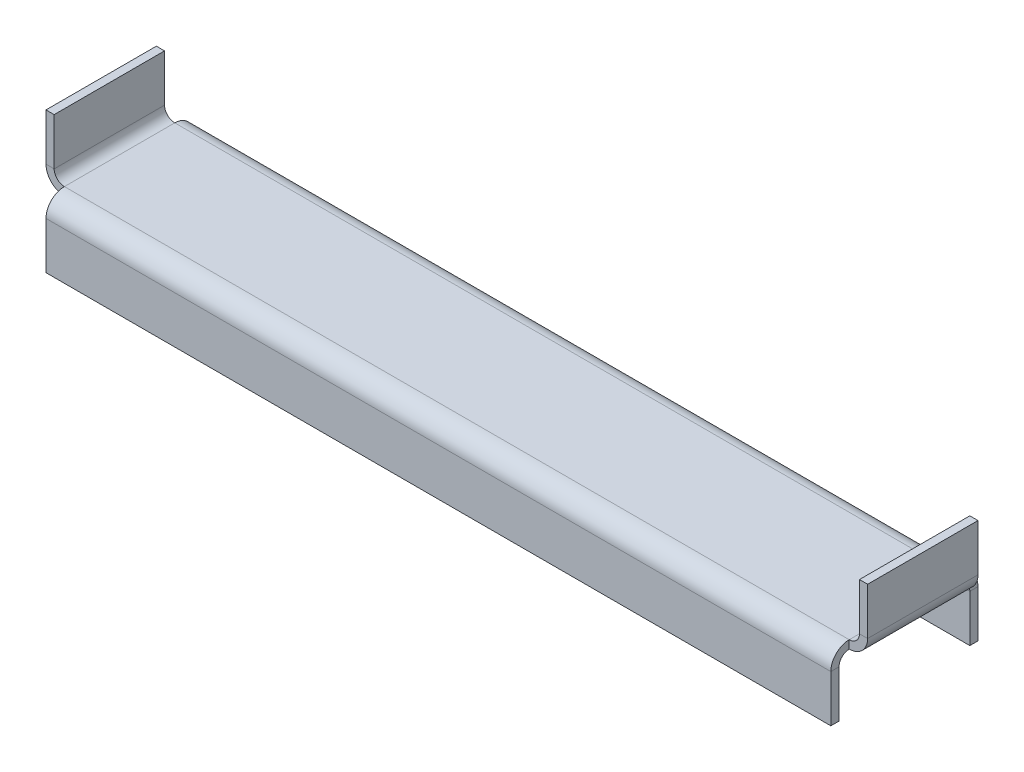
ISO-10303-21;
HEADER;
FILE_DESCRIPTION(('STEP AP214'),'2;1');
FILE_NAME('part.step','',(''),(''),'','','');
FILE_SCHEMA(('AUTOMOTIVE_DESIGN { 1 0 10303 214 1 1 1 1 }'));
ENDSEC;
DATA;
#1=APPLICATION_CONTEXT('core data for automotive mechanical design processes');
#2=APPLICATION_PROTOCOL_DEFINITION('international standard','automotive_design',2000,#1);
#3=PRODUCT_CONTEXT('',#1,'mechanical');
#4=PRODUCT('Part','Part','',(#3));
#5=PRODUCT_RELATED_PRODUCT_CATEGORY('part','',(#4));
#6=PRODUCT_DEFINITION_FORMATION('','',#4);
#7=PRODUCT_DEFINITION_CONTEXT('part definition',#1,'design');
#8=PRODUCT_DEFINITION('design','',#6,#7);
#9=PRODUCT_DEFINITION_SHAPE('','',#8);
#10=(LENGTH_UNIT() NAMED_UNIT(*) SI_UNIT(.MILLI.,.METRE.));
#11=(NAMED_UNIT(*) PLANE_ANGLE_UNIT() SI_UNIT($,.RADIAN.));
#12=(NAMED_UNIT(*) SI_UNIT($,.STERADIAN.) SOLID_ANGLE_UNIT());
#13=UNCERTAINTY_MEASURE_WITH_UNIT(LENGTH_MEASURE(1.E-05),#10,'distance_accuracy_value','');
#14=(GEOMETRIC_REPRESENTATION_CONTEXT(3) GLOBAL_UNCERTAINTY_ASSIGNED_CONTEXT((#13)) GLOBAL_UNIT_ASSIGNED_CONTEXT((#10,
#11,#12)) REPRESENTATION_CONTEXT('',''));
#15=CARTESIAN_POINT('',(0.,0.,0.));
#16=DIRECTION('',(0.,0.,1.));
#17=DIRECTION('',(1.,0.,0.));
#18=AXIS2_PLACEMENT_3D('',#15,#16,#17);
#19=CARTESIAN_POINT('',(304.8,-14.2875,-57.15));
#20=DIRECTION('',(1.,0.,0.));
#21=DIRECTION('',(0.,0.,-1.));
#22=AXIS2_PLACEMENT_3D('',#19,#20,#21);
#23=PLANE('',#22);
#24=DIRECTION('',(0.,0.,1.));
#25=VECTOR('',#24,1.);
#26=CARTESIAN_POINT('',(304.8,-14.2875,-57.15));
#27=LINE('',#26,#25);
#28=CARTESIAN_POINT('',(304.8,-14.2875,-57.15));
#29=VERTEX_POINT('',#28);
#30=CARTESIAN_POINT('',(304.8,-14.2875,-50.8));
#31=VERTEX_POINT('',#30);
#32=EDGE_CURVE('E13',#29,#31,#27,.T.);
#33=ORIENTED_EDGE('',*,*,#32,.F.);
#34=CARTESIAN_POINT('',(304.8,-14.2875,-42.8625));
#35=DIRECTION('',(-1.,0.,0.));
#36=DIRECTION('',(0.,0.,1.));
#37=AXIS2_PLACEMENT_3D('',#34,#35,#36);
#38=CIRCLE('',#37,14.2875);
#39=CARTESIAN_POINT('',(304.8,0.,-42.8625));
#40=VERTEX_POINT('',#39);
#41=EDGE_CURVE('E187',#29,#40,#38,.F.);
#42=ORIENTED_EDGE('',*,*,#41,.T.);
#43=DIRECTION('',(0.,1.,0.));
#44=VECTOR('',#43,1.);
#45=CARTESIAN_POINT('',(304.8,-6.34999999999998,-42.8625));
#46=LINE('',#45,#44);
#47=CARTESIAN_POINT('',(304.8,-6.35000000000003,-42.8625));
#48=VERTEX_POINT('',#47);
#49=EDGE_CURVE('E85',#48,#40,#46,.T.);
#50=ORIENTED_EDGE('',*,*,#49,.F.);
#51=CARTESIAN_POINT('',(304.8,-14.2875,-42.8625));
#52=DIRECTION('',(1.,0.,0.));
#53=DIRECTION('',(0.,0.,-1.));
#54=AXIS2_PLACEMENT_3D('',#51,#52,#53);
#55=CIRCLE('',#54,7.9375);
#56=EDGE_CURVE('E194',#31,#48,#55,.T.);
#57=ORIENTED_EDGE('',*,*,#56,.F.);
#58=EDGE_LOOP('',(#33,#42,#50,#57));
#59=FACE_BOUND('',#58,.T.);
#60=ADVANCED_FACE('F77',(#59),#23,.T.);
#61=CARTESIAN_POINT('',(304.8,-6.34999999999998,-42.8625));
#62=DIRECTION('',(1.,0.,0.));
#63=DIRECTION('',(0.,0.,-1.));
#64=AXIS2_PLACEMENT_3D('',#61,#62,#63);
#65=PLANE('',#64);
#66=DIRECTION('',(0.,1.,0.));
#67=VECTOR('',#66,1.);
#68=CARTESIAN_POINT('',(304.8,0.,-57.15));
#69=LINE('',#68,#67);
#70=CARTESIAN_POINT('',(304.8,-50.8,-57.15));
#71=VERTEX_POINT('',#70);
#72=EDGE_CURVE('E182',#71,#29,#69,.T.);
#73=ORIENTED_EDGE('',*,*,#72,.T.);
#74=ORIENTED_EDGE('',*,*,#32,.T.);
#75=DIRECTION('',(0.,1.,0.));
#76=VECTOR('',#75,1.);
#77=CARTESIAN_POINT('',(304.8,0.,-50.8));
#78=LINE('',#77,#76);
#79=CARTESIAN_POINT('',(304.8,-50.8,-50.8));
#80=VERTEX_POINT('',#79);
#81=EDGE_CURVE('E192',#80,#31,#78,.T.);
#82=ORIENTED_EDGE('',*,*,#81,.F.);
#83=DIRECTION('',(0.,0.,1.));
#84=VECTOR('',#83,1.);
#85=CARTESIAN_POINT('',(304.8,-50.8,-57.15));
#86=LINE('',#85,#84);
#87=EDGE_CURVE('E171',#71,#80,#86,.T.);
#88=ORIENTED_EDGE('',*,*,#87,.F.);
#89=EDGE_LOOP('',(#73,#74,#82,#88));
#90=FACE_BOUND('',#89,.T.);
#91=ADVANCED_FACE('F190',(#90),#65,.T.);
#92=CARTESIAN_POINT('',(-304.8,0.,-42.8625));
#93=DIRECTION('',(-1.,0.,0.));
#94=DIRECTION('',(0.,0.,1.));
#95=AXIS2_PLACEMENT_3D('',#92,#93,#94);
#96=PLANE('',#95);
#97=DIRECTION('',(0.,-1.,0.));
#98=VECTOR('',#97,1.);
#99=CARTESIAN_POINT('',(-304.8,0.,-42.8625));
#100=LINE('',#99,#98);
#101=CARTESIAN_POINT('',(-304.8,0.,-42.8625));
#102=VERTEX_POINT('',#101);
#103=CARTESIAN_POINT('',(-304.8,-6.34999999999998,-42.8625));
#104=VERTEX_POINT('',#103);
#105=EDGE_CURVE('E269',#102,#104,#100,.T.);
#106=ORIENTED_EDGE('',*,*,#105,.F.);
#107=CARTESIAN_POINT('',(-304.8,-14.2875,-42.8625));
#108=DIRECTION('',(-1.,0.,0.));
#109=DIRECTION('',(0.,0.,1.));
#110=AXIS2_PLACEMENT_3D('',#107,#108,#109);
#111=CIRCLE('',#110,14.2875);
#112=CARTESIAN_POINT('',(-304.8,-14.2875,-57.15));
#113=VERTEX_POINT('',#112);
#114=EDGE_CURVE('E230',#113,#102,#111,.F.);
#115=ORIENTED_EDGE('',*,*,#114,.F.);
#116=DIRECTION('',(0.,0.,-1.));
#117=VECTOR('',#116,1.);
#118=CARTESIAN_POINT('',(-304.8,-14.2875,-50.8));
#119=LINE('',#118,#117);
#120=CARTESIAN_POINT('',(-304.8,-14.2875,-50.8));
#121=VERTEX_POINT('',#120);
#122=EDGE_CURVE('E267',#121,#113,#119,.T.);
#123=ORIENTED_EDGE('',*,*,#122,.F.);
#124=CARTESIAN_POINT('',(-304.8,-14.2875,-42.8625));
#125=DIRECTION('',(1.,0.,0.));
#126=DIRECTION('',(0.,0.,-1.));
#127=AXIS2_PLACEMENT_3D('',#124,#125,#126);
#128=CIRCLE('',#127,7.9375);
#129=EDGE_CURVE('E221',#121,#104,#128,.T.);
#130=ORIENTED_EDGE('',*,*,#129,.T.);
#131=EDGE_LOOP('',(#106,#115,#123,#130));
#132=FACE_BOUND('',#131,.T.);
#133=ADVANCED_FACE('F421',(#132),#96,.T.);
#134=CARTESIAN_POINT('',(304.8,0.,42.8625));
#135=DIRECTION('',(1.,0.,0.));
#136=DIRECTION('',(0.,0.,-1.));
#137=AXIS2_PLACEMENT_3D('',#134,#135,#136);
#138=PLANE('',#137);
#139=DIRECTION('',(0.,-1.,0.));
#140=VECTOR('',#139,1.);
#141=CARTESIAN_POINT('',(304.8,0.,42.8625));
#142=LINE('',#141,#140);
#143=CARTESIAN_POINT('',(304.8,0.,42.8625));
#144=VERTEX_POINT('',#143);
#145=CARTESIAN_POINT('',(304.8,-6.35,42.8625));
#146=VERTEX_POINT('',#145);
#147=EDGE_CURVE('E264',#144,#146,#142,.T.);
#148=ORIENTED_EDGE('',*,*,#147,.F.);
#149=CARTESIAN_POINT('',(304.8,-14.2875,42.8625));
#150=DIRECTION('',(-1.,0.,0.));
#151=DIRECTION('',(0.,0.,1.));
#152=AXIS2_PLACEMENT_3D('',#149,#150,#151);
#153=CIRCLE('',#152,14.2875);
#154=CARTESIAN_POINT('',(304.8,-14.2875,57.15));
#155=VERTEX_POINT('',#154);
#156=EDGE_CURVE('E203',#144,#155,#153,.F.);
#157=ORIENTED_EDGE('',*,*,#156,.T.);
#158=DIRECTION('',(0.,0.,1.));
#159=VECTOR('',#158,1.);
#160=CARTESIAN_POINT('',(304.8,-14.2875,50.8));
#161=LINE('',#160,#159);
#162=CARTESIAN_POINT('',(304.8,-14.2875,50.8));
#163=VERTEX_POINT('',#162);
#164=EDGE_CURVE('E93',#163,#155,#161,.T.);
#165=ORIENTED_EDGE('',*,*,#164,.F.);
#166=CARTESIAN_POINT('',(304.8,-14.2875,42.8625));
#167=DIRECTION('',(1.,0.,0.));
#168=DIRECTION('',(0.,0.,-1.));
#169=AXIS2_PLACEMENT_3D('',#166,#167,#168);
#170=CIRCLE('',#169,7.9375);
#171=EDGE_CURVE('E317',#146,#163,#170,.T.);
#172=ORIENTED_EDGE('',*,*,#171,.F.);
#173=EDGE_LOOP('',(#148,#157,#165,#172));
#174=FACE_BOUND('',#173,.T.);
#175=ADVANCED_FACE('F313',(#174),#138,.T.);
#176=CARTESIAN_POINT('',(-304.8,-14.2875,57.15));
#177=DIRECTION('',(-1.,0.,0.));
#178=DIRECTION('',(0.,0.,1.));
#179=AXIS2_PLACEMENT_3D('',#176,#177,#178);
#180=PLANE('',#179);
#181=DIRECTION('',(0.,0.,-1.));
#182=VECTOR('',#181,1.);
#183=CARTESIAN_POINT('',(-304.8,-14.2875,57.15));
#184=LINE('',#183,#182);
#185=CARTESIAN_POINT('',(-304.8,-14.2875,57.15));
#186=VERTEX_POINT('',#185);
#187=CARTESIAN_POINT('',(-304.8,-14.2875,50.8));
#188=VERTEX_POINT('',#187);
#189=EDGE_CURVE('E140',#186,#188,#184,.T.);
#190=ORIENTED_EDGE('',*,*,#189,.F.);
#191=CARTESIAN_POINT('',(-304.8,-14.2875,42.8625));
#192=DIRECTION('',(-1.,0.,0.));
#193=DIRECTION('',(0.,0.,1.));
#194=AXIS2_PLACEMENT_3D('',#191,#192,#193);
#195=CIRCLE('',#194,14.2875);
#196=CARTESIAN_POINT('',(-304.8,0.,42.8625));
#197=VERTEX_POINT('',#196);
#198=EDGE_CURVE('E234',#197,#186,#195,.F.);
#199=ORIENTED_EDGE('',*,*,#198,.F.);
#200=DIRECTION('',(0.,1.,0.));
#201=VECTOR('',#200,1.);
#202=CARTESIAN_POINT('',(-304.8,-6.35,42.8625));
#203=LINE('',#202,#201);
#204=CARTESIAN_POINT('',(-304.8,-6.35000000000003,42.8625));
#205=VERTEX_POINT('',#204);
#206=EDGE_CURVE('E259',#205,#197,#203,.T.);
#207=ORIENTED_EDGE('',*,*,#206,.F.);
#208=CARTESIAN_POINT('',(-304.8,-14.2875,42.8625));
#209=DIRECTION('',(1.,0.,0.));
#210=DIRECTION('',(0.,0.,-1.));
#211=AXIS2_PLACEMENT_3D('',#208,#209,#210);
#212=CIRCLE('',#211,7.9375);
#213=EDGE_CURVE('E216',#205,#188,#212,.T.);
#214=ORIENTED_EDGE('',*,*,#213,.T.);
#215=EDGE_LOOP('',(#190,#199,#207,#214));
#216=FACE_BOUND('',#215,.T.);
#217=ADVANCED_FACE('F338',(#216),#180,.T.);
#218=CARTESIAN_POINT('',(-304.8,-6.35,42.8625));
#219=DIRECTION('',(-1.,0.,0.));
#220=DIRECTION('',(0.,0.,1.));
#221=AXIS2_PLACEMENT_3D('',#218,#219,#220);
#222=PLANE('',#221);
#223=DIRECTION('',(0.,-1.,0.));
#224=VECTOR('',#223,1.);
#225=CARTESIAN_POINT('',(-304.8,0.,57.15));
#226=LINE('',#225,#224);
#227=CARTESIAN_POINT('',(-304.8,-50.8,57.15));
#228=VERTEX_POINT('',#227);
#229=EDGE_CURVE('E206',#186,#228,#226,.T.);
#230=ORIENTED_EDGE('',*,*,#229,.F.);
#231=ORIENTED_EDGE('',*,*,#189,.T.);
#232=DIRECTION('',(0.,-1.,0.));
#233=VECTOR('',#232,1.);
#234=CARTESIAN_POINT('',(-304.8,0.,50.8));
#235=LINE('',#234,#233);
#236=CARTESIAN_POINT('',(-304.8,-50.8,50.8));
#237=VERTEX_POINT('',#236);
#238=EDGE_CURVE('E213',#188,#237,#235,.T.);
#239=ORIENTED_EDGE('',*,*,#238,.T.);
#240=DIRECTION('',(0.,0.,1.));
#241=VECTOR('',#240,1.);
#242=CARTESIAN_POINT('',(-304.8,-50.8,50.8));
#243=LINE('',#242,#241);
#244=EDGE_CURVE('E209',#237,#228,#243,.T.);
#245=ORIENTED_EDGE('',*,*,#244,.T.);
#246=EDGE_LOOP('',(#230,#231,#239,#245));
#247=FACE_BOUND('',#246,.T.);
#248=ADVANCED_FACE('F545',(#247),#222,.T.);
#249=CARTESIAN_POINT('',(304.8,0.,57.15));
#250=DIRECTION('',(0.,0.,-1.));
#251=DIRECTION('',(0.,1.,0.));
#252=AXIS2_PLACEMENT_3D('',#249,#250,#251);
#253=PLANE('',#252);
#254=ORIENTED_EDGE('',*,*,#229,.T.);
#255=DIRECTION('',(-1.,0.,0.));
#256=VECTOR('',#255,1.);
#257=CARTESIAN_POINT('',(304.8,-50.8,57.15));
#258=LINE('',#257,#256);
#259=CARTESIAN_POINT('',(304.8,-50.8,57.15));
#260=VERTEX_POINT('',#259);
#261=EDGE_CURVE('E257',#260,#228,#258,.T.);
#262=ORIENTED_EDGE('',*,*,#261,.F.);
#263=DIRECTION('',(0.,-1.,0.));
#264=VECTOR('',#263,1.);
#265=CARTESIAN_POINT('',(304.8,0.,57.15));
#266=LINE('',#265,#264);
#267=EDGE_CURVE('E146',#155,#260,#266,.T.);
#268=ORIENTED_EDGE('',*,*,#267,.F.);
#269=DIRECTION('',(-1.,0.,0.));
#270=VECTOR('',#269,1.);
#271=CARTESIAN_POINT('',(304.8,-14.2875,57.15));
#272=LINE('',#271,#270);
#273=EDGE_CURVE('E205',#155,#186,#272,.T.);
#274=ORIENTED_EDGE('',*,*,#273,.T.);
#275=EDGE_LOOP('',(#254,#262,#268,#274));
#276=FACE_BOUND('',#275,.T.);
#277=ADVANCED_FACE('F548',(#276),#253,.F.);
#278=CARTESIAN_POINT('',(304.8,-50.8,50.8));
#279=DIRECTION('',(0.,-1.,0.));
#280=DIRECTION('',(0.,0.,-1.));
#281=AXIS2_PLACEMENT_3D('',#278,#279,#280);
#282=PLANE('',#281);
#283=ORIENTED_EDGE('',*,*,#244,.F.);
#284=DIRECTION('',(-1.,0.,0.));
#285=VECTOR('',#284,1.);
#286=CARTESIAN_POINT('',(304.8,-50.8,50.8));
#287=LINE('',#286,#285);
#288=CARTESIAN_POINT('',(304.8,-50.8,50.8));
#289=VERTEX_POINT('',#288);
#290=EDGE_CURVE('E255',#289,#237,#287,.T.);
#291=ORIENTED_EDGE('',*,*,#290,.F.);
#292=DIRECTION('',(0.,0.,1.));
#293=VECTOR('',#292,1.);
#294=CARTESIAN_POINT('',(304.8,-50.8,50.8));
#295=LINE('',#294,#293);
#296=EDGE_CURVE('E402',#289,#260,#295,.T.);
#297=ORIENTED_EDGE('',*,*,#296,.T.);
#298=ORIENTED_EDGE('',*,*,#261,.T.);
#299=EDGE_LOOP('',(#283,#291,#297,#298));
#300=FACE_BOUND('',#299,.T.);
#301=ADVANCED_FACE('F552',(#300),#282,.T.);
#302=CARTESIAN_POINT('',(304.8,0.,50.8));
#303=DIRECTION('',(0.,0.,-1.));
#304=DIRECTION('',(0.,1.,0.));
#305=AXIS2_PLACEMENT_3D('',#302,#303,#304);
#306=PLANE('',#305);
#307=ORIENTED_EDGE('',*,*,#238,.F.);
#308=DIRECTION('',(-1.,0.,0.));
#309=VECTOR('',#308,1.);
#310=CARTESIAN_POINT('',(304.8,-14.2875,50.8));
#311=LINE('',#310,#309);
#312=EDGE_CURVE('E252',#163,#188,#311,.T.);
#313=ORIENTED_EDGE('',*,*,#312,.F.);
#314=DIRECTION('',(0.,-1.,0.));
#315=VECTOR('',#314,1.);
#316=CARTESIAN_POINT('',(304.8,0.,50.8));
#317=LINE('',#316,#315);
#318=EDGE_CURVE('E405',#163,#289,#317,.T.);
#319=ORIENTED_EDGE('',*,*,#318,.T.);
#320=ORIENTED_EDGE('',*,*,#290,.T.);
#321=EDGE_LOOP('',(#307,#313,#319,#320));
#322=FACE_BOUND('',#321,.T.);
#323=ADVANCED_FACE('F556',(#322),#306,.T.);
#324=CARTESIAN_POINT('',(304.8,-14.2875,42.8625));
#325=DIRECTION('',(-1.,0.,0.));
#326=DIRECTION('',(0.,0.,1.));
#327=AXIS2_PLACEMENT_3D('',#324,#325,#326);
#328=CYLINDRICAL_SURFACE('',#327,7.9375);
#329=ORIENTED_EDGE('',*,*,#213,.F.);
#330=DIRECTION('',(-1.,0.,0.));
#331=VECTOR('',#330,1.);
#332=CARTESIAN_POINT('',(304.8,-6.35,42.8625));
#333=LINE('',#332,#331);
#334=EDGE_CURVE('E249',#146,#205,#333,.T.);
#335=ORIENTED_EDGE('',*,*,#334,.F.);
#336=ORIENTED_EDGE('',*,*,#171,.T.);
#337=ORIENTED_EDGE('',*,*,#312,.T.);
#338=EDGE_LOOP('',(#329,#335,#336,#337));
#339=FACE_BOUND('',#338,.T.);
#340=ADVANCED_FACE('F327',(#339),#328,.F.);
#341=CARTESIAN_POINT('',(304.8,-6.35,57.15));
#342=DIRECTION('',(0.,-1.,0.));
#343=DIRECTION('',(0.,0.,-1.));
#344=AXIS2_PLACEMENT_3D('',#341,#342,#343);
#345=PLANE('',#344);
#346=DIRECTION('',(0.,0.,1.));
#347=VECTOR('',#346,1.);
#348=CARTESIAN_POINT('',(-304.8,-6.35,57.15));
#349=LINE('',#348,#347);
#350=EDGE_CURVE('E218',#104,#205,#349,.T.);
#351=ORIENTED_EDGE('',*,*,#350,.F.);
#352=DIRECTION('',(-1.,0.,0.));
#353=VECTOR('',#352,1.);
#354=CARTESIAN_POINT('',(304.8,-6.34999999999998,-42.8625));
#355=LINE('',#354,#353);
#356=EDGE_CURVE('E247',#48,#104,#355,.T.);
#357=ORIENTED_EDGE('',*,*,#356,.F.);
#358=DIRECTION('',(0.,0.,1.));
#359=VECTOR('',#358,1.);
#360=CARTESIAN_POINT('',(304.8,-6.35,57.15));
#361=LINE('',#360,#359);
#362=EDGE_CURVE('E334',#48,#146,#361,.T.);
#363=ORIENTED_EDGE('',*,*,#362,.T.);
#364=ORIENTED_EDGE('',*,*,#334,.T.);
#365=EDGE_LOOP('',(#351,#357,#363,#364));
#366=FACE_BOUND('',#365,.T.);
#367=ADVANCED_FACE('F332',(#366),#345,.T.);
#368=CARTESIAN_POINT('',(304.8,-14.2875,-42.8625));
#369=DIRECTION('',(-1.,0.,0.));
#370=DIRECTION('',(0.,0.,1.));
#371=AXIS2_PLACEMENT_3D('',#368,#369,#370);
#372=CYLINDRICAL_SURFACE('',#371,7.9375);
#373=ORIENTED_EDGE('',*,*,#129,.F.);
#374=DIRECTION('',(-1.,0.,0.));
#375=VECTOR('',#374,1.);
#376=CARTESIAN_POINT('',(304.8,-14.2875,-50.8));
#377=LINE('',#376,#375);
#378=EDGE_CURVE('E244',#31,#121,#377,.T.);
#379=ORIENTED_EDGE('',*,*,#378,.F.);
#380=ORIENTED_EDGE('',*,*,#56,.T.);
#381=ORIENTED_EDGE('',*,*,#356,.T.);
#382=EDGE_LOOP('',(#373,#379,#380,#381));
#383=FACE_BOUND('',#382,.T.);
#384=ADVANCED_FACE('F413',(#383),#372,.F.);
#385=CARTESIAN_POINT('',(304.8,0.,-50.8));
#386=DIRECTION('',(0.,0.,1.));
#387=DIRECTION('',(0.,-1.,0.));
#388=AXIS2_PLACEMENT_3D('',#385,#386,#387);
#389=PLANE('',#388);
#390=DIRECTION('',(0.,1.,0.));
#391=VECTOR('',#390,1.);
#392=CARTESIAN_POINT('',(-304.8,0.,-50.8));
#393=LINE('',#392,#391);
#394=CARTESIAN_POINT('',(-304.8,-50.8,-50.8));
#395=VERTEX_POINT('',#394);
#396=EDGE_CURVE('E224',#395,#121,#393,.T.);
#397=ORIENTED_EDGE('',*,*,#396,.F.);
#398=DIRECTION('',(-1.,0.,0.));
#399=VECTOR('',#398,1.);
#400=CARTESIAN_POINT('',(304.8,-50.8,-50.8));
#401=LINE('',#400,#399);
#402=EDGE_CURVE('E177',#80,#395,#401,.T.);
#403=ORIENTED_EDGE('',*,*,#402,.F.);
#404=ORIENTED_EDGE('',*,*,#81,.T.);
#405=ORIENTED_EDGE('',*,*,#378,.T.);
#406=EDGE_LOOP('',(#397,#403,#404,#405));
#407=FACE_BOUND('',#406,.T.);
#408=ADVANCED_FACE('F417',(#407),#389,.T.);
#409=CARTESIAN_POINT('',(304.8,-50.8,-57.15));
#410=DIRECTION('',(0.,-1.,0.));
#411=DIRECTION('',(0.,0.,-1.));
#412=AXIS2_PLACEMENT_3D('',#409,#410,#411);
#413=PLANE('',#412);
#414=DIRECTION('',(0.,0.,1.));
#415=VECTOR('',#414,1.);
#416=CARTESIAN_POINT('',(-304.8,-50.8,-57.15));
#417=LINE('',#416,#415);
#418=CARTESIAN_POINT('',(-304.8,-50.8,-57.15));
#419=VERTEX_POINT('',#418);
#420=EDGE_CURVE('E173',#419,#395,#417,.T.);
#421=ORIENTED_EDGE('',*,*,#420,.F.);
#422=DIRECTION('',(-1.,0.,0.));
#423=VECTOR('',#422,1.);
#424=CARTESIAN_POINT('',(304.8,-50.8,-57.15));
#425=LINE('',#424,#423);
#426=EDGE_CURVE('E167',#71,#419,#425,.T.);
#427=ORIENTED_EDGE('',*,*,#426,.F.);
#428=ORIENTED_EDGE('',*,*,#87,.T.);
#429=ORIENTED_EDGE('',*,*,#402,.T.);
#430=EDGE_LOOP('',(#421,#427,#428,#429));
#431=FACE_BOUND('',#430,.T.);
#432=ADVANCED_FACE('F169',(#431),#413,.T.);
#433=CARTESIAN_POINT('',(304.8,0.,-57.15));
#434=DIRECTION('',(0.,0.,1.));
#435=DIRECTION('',(0.,-1.,0.));
#436=AXIS2_PLACEMENT_3D('',#433,#434,#435);
#437=PLANE('',#436);
#438=DIRECTION('',(0.,1.,0.));
#439=VECTOR('',#438,1.);
#440=CARTESIAN_POINT('',(-304.8,0.,-57.15));
#441=LINE('',#440,#439);
#442=EDGE_CURVE('E228',#419,#113,#441,.T.);
#443=ORIENTED_EDGE('',*,*,#442,.T.);
#444=DIRECTION('',(-1.,0.,0.));
#445=VECTOR('',#444,1.);
#446=CARTESIAN_POINT('',(304.8,-14.2875,-57.15));
#447=LINE('',#446,#445);
#448=EDGE_CURVE('E178',#29,#113,#447,.T.);
#449=ORIENTED_EDGE('',*,*,#448,.F.);
#450=ORIENTED_EDGE('',*,*,#72,.F.);
#451=ORIENTED_EDGE('',*,*,#426,.T.);
#452=EDGE_LOOP('',(#443,#449,#450,#451));
#453=FACE_BOUND('',#452,.T.);
#454=ADVANCED_FACE('F183',(#453),#437,.F.);
#455=CARTESIAN_POINT('',(304.8,-14.2875,-42.8625));
#456=DIRECTION('',(-1.,0.,0.));
#457=DIRECTION('',(0.,0.,1.));
#458=AXIS2_PLACEMENT_3D('',#455,#456,#457);
#459=CYLINDRICAL_SURFACE('',#458,14.2875);
#460=ORIENTED_EDGE('',*,*,#114,.T.);
#461=DIRECTION('',(-1.,0.,0.));
#462=VECTOR('',#461,1.);
#463=CARTESIAN_POINT('',(304.8,0.,-42.8625));
#464=LINE('',#463,#462);
#465=EDGE_CURVE('E240',#40,#102,#464,.T.);
#466=ORIENTED_EDGE('',*,*,#465,.F.);
#467=ORIENTED_EDGE('',*,*,#41,.F.);
#468=ORIENTED_EDGE('',*,*,#448,.T.);
#469=EDGE_LOOP('',(#460,#466,#467,#468));
#470=FACE_BOUND('',#469,.T.);
#471=ADVANCED_FACE('F302',(#470),#459,.T.);
#472=CARTESIAN_POINT('',(304.8,0.,57.15));
#473=DIRECTION('',(0.,-1.,0.));
#474=DIRECTION('',(0.,0.,-1.));
#475=AXIS2_PLACEMENT_3D('',#472,#473,#474);
#476=PLANE('',#475);
#477=DIRECTION('',(0.,0.,1.));
#478=VECTOR('',#477,1.);
#479=CARTESIAN_POINT('',(-304.8,0.,57.15));
#480=LINE('',#479,#478);
#481=EDGE_CURVE('E133',#102,#197,#480,.T.);
#482=ORIENTED_EDGE('',*,*,#481,.T.);
#483=DIRECTION('',(-1.,0.,0.));
#484=VECTOR('',#483,1.);
#485=CARTESIAN_POINT('',(304.8,0.,42.8625));
#486=LINE('',#485,#484);
#487=EDGE_CURVE('E238',#144,#197,#486,.T.);
#488=ORIENTED_EDGE('',*,*,#487,.F.);
#489=DIRECTION('',(0.,0.,1.));
#490=VECTOR('',#489,1.);
#491=CARTESIAN_POINT('',(304.8,0.,57.15));
#492=LINE('',#491,#490);
#493=EDGE_CURVE('E200',#40,#144,#492,.T.);
#494=ORIENTED_EDGE('',*,*,#493,.F.);
#495=ORIENTED_EDGE('',*,*,#465,.T.);
#496=EDGE_LOOP('',(#482,#488,#494,#495));
#497=FACE_BOUND('',#496,.T.);
#498=ADVANCED_FACE('F304',(#497),#476,.F.);
#499=CARTESIAN_POINT('',(304.8,-14.2875,42.8625));
#500=DIRECTION('',(-1.,0.,0.));
#501=DIRECTION('',(0.,0.,1.));
#502=AXIS2_PLACEMENT_3D('',#499,#500,#501);
#503=CYLINDRICAL_SURFACE('',#502,14.2875);
#504=ORIENTED_EDGE('',*,*,#198,.T.);
#505=ORIENTED_EDGE('',*,*,#273,.F.);
#506=ORIENTED_EDGE('',*,*,#156,.F.);
#507=ORIENTED_EDGE('',*,*,#487,.T.);
#508=EDGE_LOOP('',(#504,#505,#506,#507));
#509=FACE_BOUND('',#508,.T.);
#510=ADVANCED_FACE('F310',(#509),#503,.T.);
#511=CARTESIAN_POINT('',(304.8,-14.2875,42.8625));
#512=DIRECTION('',(1.,0.,0.));
#513=DIRECTION('',(0.,0.,-1.));
#514=AXIS2_PLACEMENT_3D('',#511,#512,#513);
#515=PLANE('',#514);
#516=ORIENTED_EDGE('',*,*,#267,.T.);
#517=ORIENTED_EDGE('',*,*,#296,.F.);
#518=ORIENTED_EDGE('',*,*,#318,.F.);
#519=ORIENTED_EDGE('',*,*,#164,.T.);
#520=EDGE_LOOP('',(#516,#517,#518,#519));
#521=FACE_BOUND('',#520,.T.);
#522=ADVANCED_FACE('F579',(#521),#515,.T.);
#523=CARTESIAN_POINT('',(-304.8,-14.2875,42.8625));
#524=DIRECTION('',(1.,0.,0.));
#525=DIRECTION('',(0.,0.,-1.));
#526=AXIS2_PLACEMENT_3D('',#523,#524,#525);
#527=PLANE('',#526);
#528=ORIENTED_EDGE('',*,*,#396,.T.);
#529=ORIENTED_EDGE('',*,*,#122,.T.);
#530=ORIENTED_EDGE('',*,*,#442,.F.);
#531=ORIENTED_EDGE('',*,*,#420,.T.);
#532=EDGE_LOOP('',(#528,#529,#530,#531));
#533=FACE_BOUND('',#532,.T.);
#534=ADVANCED_FACE('F419',(#533),#527,.F.);
#535=CARTESIAN_POINT('',(304.8,7.93750000000002,42.8625));
#536=DIRECTION('',(0.,0.,1.));
#537=DIRECTION('',(1.,0.,0.));
#538=AXIS2_PLACEMENT_3D('',#535,#536,#537);
#539=PLANE('',#538);
#540=DIRECTION('',(-1.,0.,0.));
#541=VECTOR('',#540,1.);
#542=CARTESIAN_POINT('',(319.0875,7.93749999999996,42.8625));
#543=LINE('',#542,#541);
#544=CARTESIAN_POINT('',(312.7375,7.93749999999999,42.8625));
#545=VERTEX_POINT('',#544);
#546=CARTESIAN_POINT('',(319.0875,7.93749999999996,42.8625));
#547=VERTEX_POINT('',#546);
#548=EDGE_CURVE('E359',#545,#547,#543,.F.);
#549=ORIENTED_EDGE('',*,*,#548,.F.);
#550=CARTESIAN_POINT('',(304.8,7.93750000000002,42.8625));
#551=DIRECTION('',(0.,0.,-1.));
#552=DIRECTION('',(-1.,0.,0.));
#553=AXIS2_PLACEMENT_3D('',#550,#551,#552);
#554=CIRCLE('',#553,7.93750000000004);
#555=EDGE_CURVE('E297',#144,#545,#554,.F.);
#556=ORIENTED_EDGE('',*,*,#555,.F.);
#557=ORIENTED_EDGE('',*,*,#147,.T.);
#558=CARTESIAN_POINT('',(304.8,7.93750000000002,42.8625));
#559=DIRECTION('',(0.,0.,-1.));
#560=DIRECTION('',(-1.,0.,0.));
#561=AXIS2_PLACEMENT_3D('',#558,#559,#560);
#562=CIRCLE('',#561,14.2875);
#563=EDGE_CURVE('E210',#146,#547,#562,.F.);
#564=ORIENTED_EDGE('',*,*,#563,.T.);
#565=EDGE_LOOP('',(#549,#556,#557,#564));
#566=FACE_BOUND('',#565,.T.);
#567=ADVANCED_FACE('F323',(#566),#539,.T.);
#568=CARTESIAN_POINT('',(304.8,7.93750000000002,-42.8625));
#569=DIRECTION('',(0.,0.,1.));
#570=DIRECTION('',(1.,0.,0.));
#571=AXIS2_PLACEMENT_3D('',#568,#569,#570);
#572=PLANE('',#571);
#573=CARTESIAN_POINT('',(304.8,7.93750000000002,-42.8625));
#574=DIRECTION('',(0.,0.,-1.));
#575=DIRECTION('',(-1.,0.,0.));
#576=AXIS2_PLACEMENT_3D('',#573,#574,#575);
#577=CIRCLE('',#576,7.93750000000004);
#578=CARTESIAN_POINT('',(312.7375,7.93749999999999,-42.8625));
#579=VERTEX_POINT('',#578);
#580=EDGE_CURVE('E280',#579,#40,#577,.T.);
#581=ORIENTED_EDGE('',*,*,#580,.F.);
#582=DIRECTION('',(-1.,0.,0.));
#583=VECTOR('',#582,1.);
#584=CARTESIAN_POINT('',(312.7375,7.93749999999999,-42.8625));
#585=LINE('',#584,#583);
#586=CARTESIAN_POINT('',(319.0875,7.93749999999996,-42.8625));
#587=VERTEX_POINT('',#586);
#588=EDGE_CURVE('E394',#579,#587,#585,.F.);
#589=ORIENTED_EDGE('',*,*,#588,.T.);
#590=CARTESIAN_POINT('',(304.8,7.93750000000002,-42.8625));
#591=DIRECTION('',(0.,0.,-1.));
#592=DIRECTION('',(-1.,0.,0.));
#593=AXIS2_PLACEMENT_3D('',#590,#591,#592);
#594=CIRCLE('',#593,14.2875);
#595=EDGE_CURVE('E283',#587,#48,#594,.T.);
#596=ORIENTED_EDGE('',*,*,#595,.T.);
#597=ORIENTED_EDGE('',*,*,#49,.T.);
#598=EDGE_LOOP('',(#581,#589,#596,#597));
#599=FACE_BOUND('',#598,.T.);
#600=ADVANCED_FACE('F278',(#599),#572,.F.);
#601=CARTESIAN_POINT('',(304.8,7.93750000000002,-42.8625));
#602=DIRECTION('',(0.,0.,-1.));
#603=DIRECTION('',(1.,0.,0.));
#604=AXIS2_PLACEMENT_3D('',#601,#602,#603);
#605=CYLINDRICAL_SURFACE('',#604,14.2875);
#606=ORIENTED_EDGE('',*,*,#362,.F.);
#607=ORIENTED_EDGE('',*,*,#595,.F.);
#608=DIRECTION('',(0.,0.,-1.));
#609=VECTOR('',#608,1.);
#610=CARTESIAN_POINT('',(319.0875,7.93749999999996,42.8625));
#611=LINE('',#610,#609);
#612=EDGE_CURVE('E391',#587,#547,#611,.F.);
#613=ORIENTED_EDGE('',*,*,#612,.T.);
#614=ORIENTED_EDGE('',*,*,#563,.F.);
#615=EDGE_LOOP('',(#606,#607,#613,#614));
#616=FACE_BOUND('',#615,.T.);
#617=ADVANCED_FACE('F522',(#616),#605,.T.);
#618=CARTESIAN_POINT('',(304.8,7.93750000000002,-42.8625));
#619=DIRECTION('',(0.,0.,-1.));
#620=DIRECTION('',(1.,0.,0.));
#621=AXIS2_PLACEMENT_3D('',#618,#619,#620);
#622=CYLINDRICAL_SURFACE('',#621,7.93750000000004);
#623=ORIENTED_EDGE('',*,*,#493,.T.);
#624=ORIENTED_EDGE('',*,*,#555,.T.);
#625=DIRECTION('',(0.,0.,-1.));
#626=VECTOR('',#625,1.);
#627=CARTESIAN_POINT('',(312.7375,7.93749999999999,42.8625));
#628=LINE('',#627,#626);
#629=EDGE_CURVE('E296',#545,#579,#628,.T.);
#630=ORIENTED_EDGE('',*,*,#629,.T.);
#631=ORIENTED_EDGE('',*,*,#580,.T.);
#632=EDGE_LOOP('',(#623,#624,#630,#631));
#633=FACE_BOUND('',#632,.T.);
#634=ADVANCED_FACE('F291',(#633),#622,.F.);
#635=CARTESIAN_POINT('',(319.0875,44.45,-42.8625));
#636=DIRECTION('',(0.,0.,1.));
#637=DIRECTION('',(0.,-1.,0.));
#638=AXIS2_PLACEMENT_3D('',#635,#636,#637);
#639=PLANE('',#638);
#640=ORIENTED_EDGE('',*,*,#588,.F.);
#641=DIRECTION('',(0.,-1.,0.));
#642=VECTOR('',#641,1.);
#643=CARTESIAN_POINT('',(312.7375,44.45,-42.8625));
#644=LINE('',#643,#642);
#645=CARTESIAN_POINT('',(312.7375,44.45,-42.8625));
#646=VERTEX_POINT('',#645);
#647=EDGE_CURVE('E388',#579,#646,#644,.F.);
#648=ORIENTED_EDGE('',*,*,#647,.T.);
#649=DIRECTION('',(-1.,0.,0.));
#650=VECTOR('',#649,1.);
#651=CARTESIAN_POINT('',(319.0875,44.45,-42.8625));
#652=LINE('',#651,#650);
#653=CARTESIAN_POINT('',(319.0875,44.45,-42.8625));
#654=VERTEX_POINT('',#653);
#655=EDGE_CURVE('E298',#654,#646,#652,.T.);
#656=ORIENTED_EDGE('',*,*,#655,.F.);
#657=DIRECTION('',(0.,1.,0.));
#658=VECTOR('',#657,1.);
#659=CARTESIAN_POINT('',(319.0875,-1.15742351270876E-12,-42.8625));
#660=LINE('',#659,#658);
#661=EDGE_CURVE('E379',#587,#654,#660,.T.);
#662=ORIENTED_EDGE('',*,*,#661,.F.);
#663=EDGE_LOOP('',(#640,#648,#656,#662));
#664=FACE_BOUND('',#663,.T.);
#665=ADVANCED_FACE('F517',(#664),#639,.F.);
#666=CARTESIAN_POINT('',(319.0875,0.,42.8625));
#667=DIRECTION('',(0.,0.,-1.));
#668=DIRECTION('',(0.,1.,0.));
#669=AXIS2_PLACEMENT_3D('',#666,#667,#668);
#670=PLANE('',#669);
#671=ORIENTED_EDGE('',*,*,#548,.T.);
#672=DIRECTION('',(0.,-1.,0.));
#673=VECTOR('',#672,1.);
#674=CARTESIAN_POINT('',(319.0875,-1.17080566523773E-12,42.8625));
#675=LINE('',#674,#673);
#676=CARTESIAN_POINT('',(319.0875,44.45,42.8625));
#677=VERTEX_POINT('',#676);
#678=EDGE_CURVE('E373',#677,#547,#675,.T.);
#679=ORIENTED_EDGE('',*,*,#678,.F.);
#680=DIRECTION('',(-1.,0.,0.));
#681=VECTOR('',#680,1.);
#682=CARTESIAN_POINT('',(319.0875,44.45,42.8625));
#683=LINE('',#682,#681);
#684=CARTESIAN_POINT('',(312.7375,44.45,42.8625));
#685=VERTEX_POINT('',#684);
#686=EDGE_CURVE('E370',#677,#685,#683,.T.);
#687=ORIENTED_EDGE('',*,*,#686,.T.);
#688=DIRECTION('',(0.,1.,0.));
#689=VECTOR('',#688,1.);
#690=CARTESIAN_POINT('',(312.7375,0.,42.8625));
#691=LINE('',#690,#689);
#692=EDGE_CURVE('E382',#685,#545,#691,.F.);
#693=ORIENTED_EDGE('',*,*,#692,.T.);
#694=EDGE_LOOP('',(#671,#679,#687,#693));
#695=FACE_BOUND('',#694,.T.);
#696=ADVANCED_FACE('F509',(#695),#670,.F.);
#697=CARTESIAN_POINT('',(319.0875,-1.16411458897324E-12,0.));
#698=DIRECTION('',(-1.,0.,0.));
#699=DIRECTION('',(0.,-1.,0.));
#700=AXIS2_PLACEMENT_3D('',#697,#698,#699);
#701=PLANE('',#700);
#702=ORIENTED_EDGE('',*,*,#612,.F.);
#703=ORIENTED_EDGE('',*,*,#661,.T.);
#704=DIRECTION('',(0.,0.,1.));
#705=VECTOR('',#704,1.);
#706=CARTESIAN_POINT('',(319.0875,44.45,0.));
#707=LINE('',#706,#705);
#708=EDGE_CURVE('E376',#654,#677,#707,.T.);
#709=ORIENTED_EDGE('',*,*,#708,.T.);
#710=ORIENTED_EDGE('',*,*,#678,.T.);
#711=EDGE_LOOP('',(#702,#703,#709,#710));
#712=FACE_BOUND('',#711,.T.);
#713=ADVANCED_FACE('F520',(#712),#701,.F.);
#714=CARTESIAN_POINT('',(312.7375,-1.14194368247159E-12,0.));
#715=DIRECTION('',(-1.,0.,0.));
#716=DIRECTION('',(0.,-1.,0.));
#717=AXIS2_PLACEMENT_3D('',#714,#715,#716);
#718=PLANE('',#717);
#719=ORIENTED_EDGE('',*,*,#647,.F.);
#720=ORIENTED_EDGE('',*,*,#629,.F.);
#721=ORIENTED_EDGE('',*,*,#692,.F.);
#722=DIRECTION('',(0.,0.,-1.));
#723=VECTOR('',#722,1.);
#724=CARTESIAN_POINT('',(312.7375,44.45,42.8625));
#725=LINE('',#724,#723);
#726=EDGE_CURVE('E385',#646,#685,#725,.F.);
#727=ORIENTED_EDGE('',*,*,#726,.F.);
#728=EDGE_LOOP('',(#719,#720,#721,#727));
#729=FACE_BOUND('',#728,.T.);
#730=ADVANCED_FACE('F507',(#729),#718,.T.);
#731=CARTESIAN_POINT('',(319.0875,44.45,42.8625));
#732=DIRECTION('',(0.,-1.,0.));
#733=DIRECTION('',(1.,0.,0.));
#734=AXIS2_PLACEMENT_3D('',#731,#732,#733);
#735=PLANE('',#734);
#736=ORIENTED_EDGE('',*,*,#726,.T.);
#737=ORIENTED_EDGE('',*,*,#686,.F.);
#738=ORIENTED_EDGE('',*,*,#708,.F.);
#739=ORIENTED_EDGE('',*,*,#655,.T.);
#740=EDGE_LOOP('',(#736,#737,#738,#739));
#741=FACE_BOUND('',#740,.T.);
#742=ADVANCED_FACE('F513',(#741),#735,.F.);
#743=CARTESIAN_POINT('',(-304.8,7.93750000000002,-42.8625));
#744=DIRECTION('',(0.,0.,-1.));
#745=DIRECTION('',(-1.,0.,0.));
#746=AXIS2_PLACEMENT_3D('',#743,#744,#745);
#747=PLANE('',#746);
#748=DIRECTION('',(1.,0.,0.));
#749=VECTOR('',#748,1.);
#750=CARTESIAN_POINT('',(-319.0875,7.93749999999996,-42.8625));
#751=LINE('',#750,#749);
#752=CARTESIAN_POINT('',(-312.7375,7.93749999999999,-42.8625));
#753=VERTEX_POINT('',#752);
#754=CARTESIAN_POINT('',(-319.0875,7.93749999999996,-42.8625));
#755=VERTEX_POINT('',#754);
#756=EDGE_CURVE('E428',#753,#755,#751,.F.);
#757=ORIENTED_EDGE('',*,*,#756,.F.);
#758=CARTESIAN_POINT('',(-304.8,7.93750000000002,-42.8625));
#759=DIRECTION('',(0.,0.,1.));
#760=DIRECTION('',(1.,0.,0.));
#761=AXIS2_PLACEMENT_3D('',#758,#759,#760);
#762=CIRCLE('',#761,7.93750000000004);
#763=EDGE_CURVE('E357',#102,#753,#762,.F.);
#764=ORIENTED_EDGE('',*,*,#763,.F.);
#765=ORIENTED_EDGE('',*,*,#105,.T.);
#766=CARTESIAN_POINT('',(-304.8,7.93750000000002,-42.8625));
#767=DIRECTION('',(0.,0.,1.));
#768=DIRECTION('',(1.,0.,0.));
#769=AXIS2_PLACEMENT_3D('',#766,#767,#768);
#770=CIRCLE('',#769,14.2875);
#771=EDGE_CURVE('E352',#104,#755,#770,.F.);
#772=ORIENTED_EDGE('',*,*,#771,.T.);
#773=EDGE_LOOP('',(#757,#764,#765,#772));
#774=FACE_BOUND('',#773,.T.);
#775=ADVANCED_FACE('F425',(#774),#747,.T.);
#776=CARTESIAN_POINT('',(-304.8,7.93750000000002,42.8625));
#777=DIRECTION('',(0.,0.,-1.));
#778=DIRECTION('',(-1.,0.,0.));
#779=AXIS2_PLACEMENT_3D('',#776,#777,#778);
#780=PLANE('',#779);
#781=CARTESIAN_POINT('',(-304.8,7.93750000000002,42.8625));
#782=DIRECTION('',(0.,0.,1.));
#783=DIRECTION('',(1.,0.,0.));
#784=AXIS2_PLACEMENT_3D('',#781,#782,#783);
#785=CIRCLE('',#784,7.93750000000004);
#786=CARTESIAN_POINT('',(-312.7375,7.93749999999999,42.8625));
#787=VERTEX_POINT('',#786);
#788=EDGE_CURVE('E362',#787,#197,#785,.T.);
#789=ORIENTED_EDGE('',*,*,#788,.F.);
#790=DIRECTION('',(1.,0.,0.));
#791=VECTOR('',#790,1.);
#792=CARTESIAN_POINT('',(-312.7375,7.93749999999999,42.8625));
#793=LINE('',#792,#791);
#794=CARTESIAN_POINT('',(-319.0875,7.93749999999996,42.8625));
#795=VERTEX_POINT('',#794);
#796=EDGE_CURVE('E355',#787,#795,#793,.F.);
#797=ORIENTED_EDGE('',*,*,#796,.T.);
#798=CARTESIAN_POINT('',(-304.8,7.93750000000002,42.8625));
#799=DIRECTION('',(0.,0.,1.));
#800=DIRECTION('',(1.,0.,0.));
#801=AXIS2_PLACEMENT_3D('',#798,#799,#800);
#802=CIRCLE('',#801,14.2875);
#803=EDGE_CURVE('E349',#795,#205,#802,.T.);
#804=ORIENTED_EDGE('',*,*,#803,.T.);
#805=ORIENTED_EDGE('',*,*,#206,.T.);
#806=EDGE_LOOP('',(#789,#797,#804,#805));
#807=FACE_BOUND('',#806,.T.);
#808=ADVANCED_FACE('F353',(#807),#780,.F.);
#809=CARTESIAN_POINT('',(-304.8,7.93750000000002,42.8625));
#810=DIRECTION('',(0.,0.,1.));
#811=DIRECTION('',(-1.,0.,0.));
#812=AXIS2_PLACEMENT_3D('',#809,#810,#811);
#813=CYLINDRICAL_SURFACE('',#812,14.2875);
#814=ORIENTED_EDGE('',*,*,#350,.T.);
#815=ORIENTED_EDGE('',*,*,#803,.F.);
#816=DIRECTION('',(0.,0.,1.));
#817=VECTOR('',#816,1.);
#818=CARTESIAN_POINT('',(-319.0875,7.93749999999996,-42.8625));
#819=LINE('',#818,#817);
#820=EDGE_CURVE('E455',#795,#755,#819,.F.);
#821=ORIENTED_EDGE('',*,*,#820,.T.);
#822=ORIENTED_EDGE('',*,*,#771,.F.);
#823=EDGE_LOOP('',(#814,#815,#821,#822));
#824=FACE_BOUND('',#823,.T.);
#825=ADVANCED_FACE('F346',(#824),#813,.T.);
#826=CARTESIAN_POINT('',(-304.8,7.93750000000002,42.8625));
#827=DIRECTION('',(0.,0.,1.));
#828=DIRECTION('',(-1.,0.,0.));
#829=AXIS2_PLACEMENT_3D('',#826,#827,#828);
#830=CYLINDRICAL_SURFACE('',#829,7.93750000000004);
#831=ORIENTED_EDGE('',*,*,#481,.F.);
#832=ORIENTED_EDGE('',*,*,#763,.T.);
#833=DIRECTION('',(0.,0.,1.));
#834=VECTOR('',#833,1.);
#835=CARTESIAN_POINT('',(-312.7375,7.93749999999999,-42.8625));
#836=LINE('',#835,#834);
#837=EDGE_CURVE('E434',#753,#787,#836,.T.);
#838=ORIENTED_EDGE('',*,*,#837,.T.);
#839=ORIENTED_EDGE('',*,*,#788,.T.);
#840=EDGE_LOOP('',(#831,#832,#838,#839));
#841=FACE_BOUND('',#840,.T.);
#842=ADVANCED_FACE('F432',(#841),#830,.F.);
#843=CARTESIAN_POINT('',(-319.0875,0.,-42.8625));
#844=DIRECTION('',(0.,0.,1.));
#845=DIRECTION('',(0.,-1.,0.));
#846=AXIS2_PLACEMENT_3D('',#843,#844,#845);
#847=PLANE('',#846);
#848=ORIENTED_EDGE('',*,*,#756,.T.);
#849=DIRECTION('',(0.,-1.,0.));
#850=VECTOR('',#849,1.);
#851=CARTESIAN_POINT('',(-319.0875,-1.15742351270876E-12,-42.8625));
#852=LINE('',#851,#850);
#853=CARTESIAN_POINT('',(-319.0875,44.45,-42.8625));
#854=VERTEX_POINT('',#853);
#855=EDGE_CURVE('E464',#854,#755,#852,.T.);
#856=ORIENTED_EDGE('',*,*,#855,.F.);
#857=DIRECTION('',(1.,0.,0.));
#858=VECTOR('',#857,1.);
#859=CARTESIAN_POINT('',(-319.0875,44.45,-42.8625));
#860=LINE('',#859,#858);
#861=CARTESIAN_POINT('',(-312.7375,44.45,-42.8625));
#862=VERTEX_POINT('',#861);
#863=EDGE_CURVE('E454',#854,#862,#860,.T.);
#864=ORIENTED_EDGE('',*,*,#863,.T.);
#865=DIRECTION('',(0.,1.,0.));
#866=VECTOR('',#865,1.);
#867=CARTESIAN_POINT('',(-312.7375,0.,-42.8625));
#868=LINE('',#867,#866);
#869=EDGE_CURVE('E444',#862,#753,#868,.F.);
#870=ORIENTED_EDGE('',*,*,#869,.T.);
#871=EDGE_LOOP('',(#848,#856,#864,#870));
#872=FACE_BOUND('',#871,.T.);
#873=ADVANCED_FACE('F450',(#872),#847,.F.);
#874=CARTESIAN_POINT('',(-319.0875,44.45,42.8625));
#875=DIRECTION('',(0.,0.,-1.));
#876=DIRECTION('',(0.,1.,0.));
#877=AXIS2_PLACEMENT_3D('',#874,#875,#876);
#878=PLANE('',#877);
#879=ORIENTED_EDGE('',*,*,#796,.F.);
#880=DIRECTION('',(0.,-1.,0.));
#881=VECTOR('',#880,1.);
#882=CARTESIAN_POINT('',(-312.7375,44.45,42.8625));
#883=LINE('',#882,#881);
#884=CARTESIAN_POINT('',(-312.7375,44.45,42.8625));
#885=VERTEX_POINT('',#884);
#886=EDGE_CURVE('E446',#787,#885,#883,.F.);
#887=ORIENTED_EDGE('',*,*,#886,.T.);
#888=DIRECTION('',(1.,0.,0.));
#889=VECTOR('',#888,1.);
#890=CARTESIAN_POINT('',(-319.0875,44.45,42.8625));
#891=LINE('',#890,#889);
#892=CARTESIAN_POINT('',(-319.0875,44.45,42.8625));
#893=VERTEX_POINT('',#892);
#894=EDGE_CURVE('E367',#893,#885,#891,.T.);
#895=ORIENTED_EDGE('',*,*,#894,.F.);
#896=DIRECTION('',(0.,1.,0.));
#897=VECTOR('',#896,1.);
#898=CARTESIAN_POINT('',(-319.0875,-1.17080566523773E-12,42.8625));
#899=LINE('',#898,#897);
#900=EDGE_CURVE('E466',#795,#893,#899,.T.);
#901=ORIENTED_EDGE('',*,*,#900,.F.);
#902=EDGE_LOOP('',(#879,#887,#895,#901));
#903=FACE_BOUND('',#902,.T.);
#904=ADVANCED_FACE('F483',(#903),#878,.F.);
#905=CARTESIAN_POINT('',(-319.0875,-1.16411458897324E-12,0.));
#906=DIRECTION('',(1.,0.,0.));
#907=DIRECTION('',(0.,1.,0.));
#908=AXIS2_PLACEMENT_3D('',#905,#906,#907);
#909=PLANE('',#908);
#910=ORIENTED_EDGE('',*,*,#820,.F.);
#911=ORIENTED_EDGE('',*,*,#900,.T.);
#912=DIRECTION('',(0.,0.,-1.));
#913=VECTOR('',#912,1.);
#914=CARTESIAN_POINT('',(-319.0875,44.45,0.));
#915=LINE('',#914,#913);
#916=EDGE_CURVE('E469',#893,#854,#915,.T.);
#917=ORIENTED_EDGE('',*,*,#916,.T.);
#918=ORIENTED_EDGE('',*,*,#855,.T.);
#919=EDGE_LOOP('',(#910,#911,#917,#918));
#920=FACE_BOUND('',#919,.T.);
#921=ADVANCED_FACE('F705',(#920),#909,.F.);
#922=CARTESIAN_POINT('',(-312.7375,-1.14194368247159E-12,0.));
#923=DIRECTION('',(1.,0.,0.));
#924=DIRECTION('',(0.,1.,0.));
#925=AXIS2_PLACEMENT_3D('',#922,#923,#924);
#926=PLANE('',#925);
#927=ORIENTED_EDGE('',*,*,#886,.F.);
#928=ORIENTED_EDGE('',*,*,#837,.F.);
#929=ORIENTED_EDGE('',*,*,#869,.F.);
#930=DIRECTION('',(0.,0.,1.));
#931=VECTOR('',#930,1.);
#932=CARTESIAN_POINT('',(-312.7375,44.45,-42.8625));
#933=LINE('',#932,#931);
#934=EDGE_CURVE('E457',#885,#862,#933,.F.);
#935=ORIENTED_EDGE('',*,*,#934,.F.);
#936=EDGE_LOOP('',(#927,#928,#929,#935));
#937=FACE_BOUND('',#936,.T.);
#938=ADVANCED_FACE('F441',(#937),#926,.T.);
#939=CARTESIAN_POINT('',(-319.0875,44.45,-42.8625));
#940=DIRECTION('',(0.,-1.,0.));
#941=DIRECTION('',(1.,0.,0.));
#942=AXIS2_PLACEMENT_3D('',#939,#940,#941);
#943=PLANE('',#942);
#944=ORIENTED_EDGE('',*,*,#934,.T.);
#945=ORIENTED_EDGE('',*,*,#863,.F.);
#946=ORIENTED_EDGE('',*,*,#916,.F.);
#947=ORIENTED_EDGE('',*,*,#894,.T.);
#948=EDGE_LOOP('',(#944,#945,#946,#947));
#949=FACE_BOUND('',#948,.T.);
#950=ADVANCED_FACE('F478',(#949),#943,.F.);
#951=CLOSED_SHELL('',(#60,#91,#133,#175,#217,#248,#277,#301,#323,#340,#367,#384,#408,#432,#454,
#471,#498,#510,#522,#534,#567,#600,#617,#634,#665,#696,#713,#730,#742,#775,#808,#825,#842,#873,
#904,#921,#938,#950));
#952=MANIFOLD_SOLID_BREP('B2',#951);
#953=ADVANCED_BREP_SHAPE_REPRESENTATION('',(#18,#952),#14);
#954=SHAPE_DEFINITION_REPRESENTATION(#9,#953);
ENDSEC;
END-ISO-10303-21;
